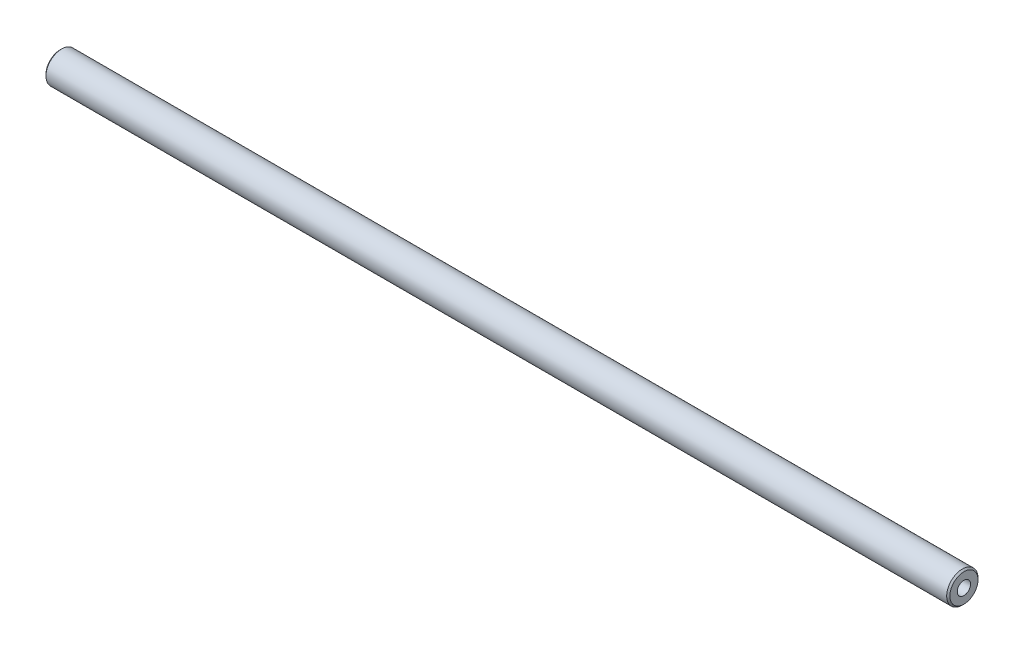
ISO-10303-21;
HEADER;
FILE_DESCRIPTION(('STEP AP214'),'2;1');
FILE_NAME('part.step','',(''),(''),'','','');
FILE_SCHEMA(('AUTOMOTIVE_DESIGN { 1 0 10303 214 1 1 1 1 }'));
ENDSEC;
DATA;
#1=APPLICATION_CONTEXT('core data for automotive mechanical design processes');
#2=APPLICATION_PROTOCOL_DEFINITION('international standard','automotive_design',2000,#1);
#3=PRODUCT_CONTEXT('',#1,'mechanical');
#4=PRODUCT('Part','Part','',(#3));
#5=PRODUCT_RELATED_PRODUCT_CATEGORY('part','',(#4));
#6=PRODUCT_DEFINITION_FORMATION('','',#4);
#7=PRODUCT_DEFINITION_CONTEXT('part definition',#1,'design');
#8=PRODUCT_DEFINITION('design','',#6,#7);
#9=PRODUCT_DEFINITION_SHAPE('','',#8);
#10=(LENGTH_UNIT() NAMED_UNIT(*) SI_UNIT(.MILLI.,.METRE.));
#11=(NAMED_UNIT(*) PLANE_ANGLE_UNIT() SI_UNIT($,.RADIAN.));
#12=(NAMED_UNIT(*) SI_UNIT($,.STERADIAN.) SOLID_ANGLE_UNIT());
#13=UNCERTAINTY_MEASURE_WITH_UNIT(LENGTH_MEASURE(1.E-05),#10,'distance_accuracy_value','');
#14=(GEOMETRIC_REPRESENTATION_CONTEXT(3) GLOBAL_UNCERTAINTY_ASSIGNED_CONTEXT((#13)) GLOBAL_UNIT_ASSIGNED_CONTEXT((#10,
#11,#12)) REPRESENTATION_CONTEXT('',''));
#15=CARTESIAN_POINT('',(0.,0.,0.));
#16=DIRECTION('',(0.,0.,1.));
#17=DIRECTION('',(1.,0.,0.));
#18=AXIS2_PLACEMENT_3D('',#15,#16,#17);
#19=CARTESIAN_POINT('',(288.75,0.,0.));
#20=DIRECTION('',(-1.,0.,0.));
#21=DIRECTION('',(0.,0.,1.));
#22=AXIS2_PLACEMENT_3D('',#19,#20,#21);
#23=CYLINDRICAL_SURFACE('',#22,10.);
#24=CARTESIAN_POINT('',(287.75,0.,0.));
#25=DIRECTION('',(1.,0.,0.));
#26=DIRECTION('',(0.,0.,-1.));
#27=AXIS2_PLACEMENT_3D('',#24,#25,#26);
#28=CIRCLE('',#27,10.);
#29=CARTESIAN_POINT('',(287.75,0.,-10.));
#30=VERTEX_POINT('',#29);
#31=EDGE_CURVE('E45',#30,#30,#28,.F.);
#32=ORIENTED_EDGE('',*,*,#31,.T.);
#33=EDGE_LOOP('',(#32));
#34=FACE_BOUND('',#33,.T.);
#35=CARTESIAN_POINT('',(-287.75,0.,0.));
#36=DIRECTION('',(1.,0.,0.));
#37=DIRECTION('',(0.,0.,-1.));
#38=AXIS2_PLACEMENT_3D('',#35,#36,#37);
#39=CIRCLE('',#38,10.);
#40=CARTESIAN_POINT('',(-287.75,0.,-10.));
#41=VERTEX_POINT('',#40);
#42=EDGE_CURVE('E62',#41,#41,#39,.T.);
#43=ORIENTED_EDGE('',*,*,#42,.T.);
#44=EDGE_LOOP('',(#43));
#45=FACE_BOUND('',#44,.T.);
#46=ADVANCED_FACE('F38',(#34,#45),#23,.T.);
#47=CARTESIAN_POINT('',(288.75,0.,0.));
#48=DIRECTION('',(1.,0.,0.));
#49=DIRECTION('',(0.,0.,-1.));
#50=AXIS2_PLACEMENT_3D('',#47,#48,#49);
#51=PLANE('',#50);
#52=CARTESIAN_POINT('',(288.75,0.,0.));
#53=DIRECTION('',(1.,0.,0.));
#54=DIRECTION('',(0.,0.,-1.));
#55=AXIS2_PLACEMENT_3D('',#52,#53,#54);
#56=CIRCLE('',#55,8.9999999999999);
#57=CARTESIAN_POINT('',(288.75,0.,-8.9999999999999));
#58=VERTEX_POINT('',#57);
#59=EDGE_CURVE('E58',#58,#58,#56,.T.);
#60=ORIENTED_EDGE('',*,*,#59,.T.);
#61=EDGE_LOOP('',(#60));
#62=FACE_BOUND('',#61,.T.);
#63=CARTESIAN_POINT('',(288.75,0.,0.));
#64=DIRECTION('',(1.,0.,0.));
#65=DIRECTION('',(0.,0.,-1.));
#66=AXIS2_PLACEMENT_3D('',#63,#64,#65);
#67=CIRCLE('',#66,4.25);
#68=CARTESIAN_POINT('',(288.75,0.,-4.25));
#69=VERTEX_POINT('',#68);
#70=EDGE_CURVE('E59',#69,#69,#67,.T.);
#71=ORIENTED_EDGE('',*,*,#70,.F.);
#72=EDGE_LOOP('',(#71));
#73=FACE_BOUND('',#72,.T.);
#74=ADVANCED_FACE('F78',(#62,#73),#51,.T.);
#75=CARTESIAN_POINT('',(-288.75,0.,0.));
#76=DIRECTION('',(1.,0.,0.));
#77=DIRECTION('',(0.,0.,-1.));
#78=AXIS2_PLACEMENT_3D('',#75,#76,#77);
#79=PLANE('',#78);
#80=CARTESIAN_POINT('',(-288.75,0.,0.));
#81=DIRECTION('',(1.,0.,0.));
#82=DIRECTION('',(0.,0.,-1.));
#83=AXIS2_PLACEMENT_3D('',#80,#81,#82);
#84=CIRCLE('',#83,8.99999999999995);
#85=CARTESIAN_POINT('',(-288.75,0.,-8.99999999999995));
#86=VERTEX_POINT('',#85);
#87=EDGE_CURVE('E11',#86,#86,#84,.F.);
#88=ORIENTED_EDGE('',*,*,#87,.T.);
#89=EDGE_LOOP('',(#88));
#90=FACE_BOUND('',#89,.T.);
#91=ADVANCED_FACE('F52',(#90),#79,.F.);
#92=CARTESIAN_POINT('',(264.25,0.,0.));
#93=DIRECTION('',(1.,0.,0.));
#94=DIRECTION('',(0.,0.,-1.));
#95=AXIS2_PLACEMENT_3D('',#92,#93,#94);
#96=CONICAL_SURFACE('',#95,4.24999999999999,1.02974425867665);
#97=CARTESIAN_POINT('',(261.696342369133,0.,0.));
#98=VERTEX_POINT('',#97);
#99=VERTEX_LOOP('',#98);
#100=FACE_BOUND('',#99,.T.);
#101=CARTESIAN_POINT('',(264.25,0.,0.));
#102=DIRECTION('',(1.,0.,0.));
#103=DIRECTION('',(0.,0.,-1.));
#104=AXIS2_PLACEMENT_3D('',#101,#102,#103);
#105=CIRCLE('',#104,4.24999999999999);
#106=CARTESIAN_POINT('',(264.25,0.,-4.24999999999999));
#107=VERTEX_POINT('',#106);
#108=EDGE_CURVE('E56',#107,#107,#105,.T.);
#109=ORIENTED_EDGE('',*,*,#108,.T.);
#110=EDGE_LOOP('',(#109));
#111=FACE_BOUND('',#110,.T.);
#112=ADVANCED_FACE('F48',(#100,#111),#96,.F.);
#113=CARTESIAN_POINT('',(288.75,0.,0.));
#114=DIRECTION('',(1.,0.,0.));
#115=DIRECTION('',(0.,0.,-1.));
#116=AXIS2_PLACEMENT_3D('',#113,#114,#115);
#117=CYLINDRICAL_SURFACE('',#116,4.25);
#118=ORIENTED_EDGE('',*,*,#108,.F.);
#119=EDGE_LOOP('',(#118));
#120=FACE_BOUND('',#119,.T.);
#121=ORIENTED_EDGE('',*,*,#70,.T.);
#122=EDGE_LOOP('',(#121));
#123=FACE_BOUND('',#122,.T.);
#124=ADVANCED_FACE('F51',(#120,#123),#117,.F.);
#125=CARTESIAN_POINT('',(288.75,0.,0.));
#126=DIRECTION('',(-1.,0.,0.));
#127=DIRECTION('',(0.,0.,1.));
#128=AXIS2_PLACEMENT_3D('',#125,#126,#127);
#129=CONICAL_SURFACE('',#128,8.9999999999999,0.785398163397472);
#130=ORIENTED_EDGE('',*,*,#31,.F.);
#131=EDGE_LOOP('',(#130));
#132=FACE_BOUND('',#131,.T.);
#133=ORIENTED_EDGE('',*,*,#59,.F.);
#134=EDGE_LOOP('',(#133));
#135=FACE_BOUND('',#134,.T.);
#136=ADVANCED_FACE('F73',(#132,#135),#129,.T.);
#137=CARTESIAN_POINT('',(-287.75,0.,0.));
#138=DIRECTION('',(1.,0.,0.));
#139=DIRECTION('',(0.,0.,-1.));
#140=AXIS2_PLACEMENT_3D('',#137,#138,#139);
#141=CONICAL_SURFACE('',#140,10.,0.785398163397472);
#142=ORIENTED_EDGE('',*,*,#87,.F.);
#143=EDGE_LOOP('',(#142));
#144=FACE_BOUND('',#143,.T.);
#145=ORIENTED_EDGE('',*,*,#42,.F.);
#146=EDGE_LOOP('',(#145));
#147=FACE_BOUND('',#146,.T.);
#148=ADVANCED_FACE('F40',(#144,#147),#141,.T.);
#149=CLOSED_SHELL('',(#46,#74,#91,#112,#124,#136,#148));
#150=MANIFOLD_SOLID_BREP('B2',#149);
#151=ADVANCED_BREP_SHAPE_REPRESENTATION('',(#18,#150),#14);
#152=SHAPE_DEFINITION_REPRESENTATION(#9,#151);
ENDSEC;
END-ISO-10303-21;
